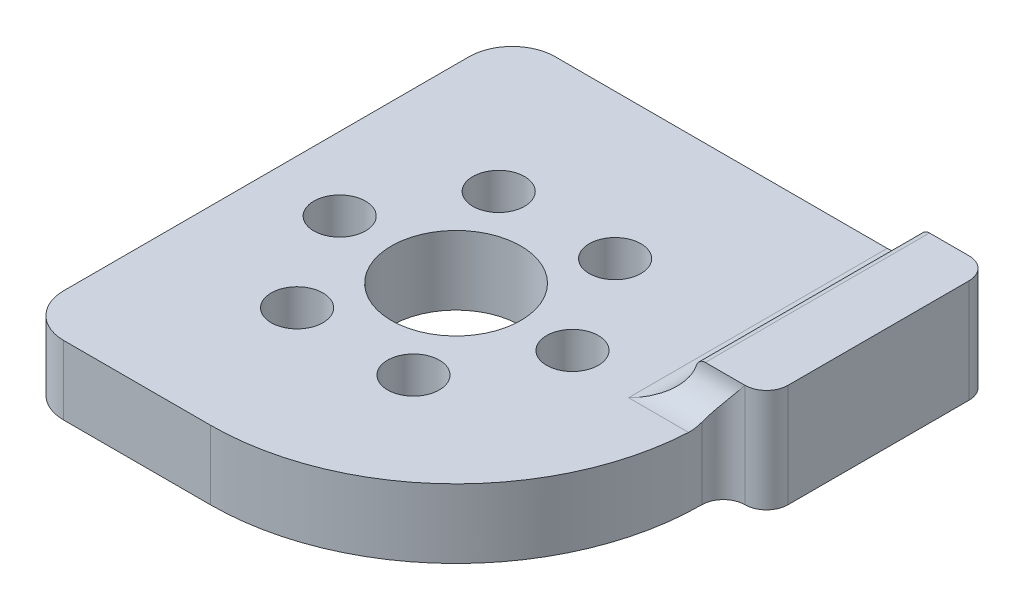
ISO-10303-21;
HEADER;
FILE_DESCRIPTION(('STEP AP214'),'2;1');
FILE_NAME('part.step','',(''),(''),'','','');
FILE_SCHEMA(('AUTOMOTIVE_DESIGN { 1 0 10303 214 1 1 1 1 }'));
ENDSEC;
DATA;
#1=APPLICATION_CONTEXT('core data for automotive mechanical design processes');
#2=APPLICATION_PROTOCOL_DEFINITION('international standard','automotive_design',2000,#1);
#3=PRODUCT_CONTEXT('',#1,'mechanical');
#4=PRODUCT('Part','Part','',(#3));
#5=PRODUCT_RELATED_PRODUCT_CATEGORY('part','',(#4));
#6=PRODUCT_DEFINITION_FORMATION('','',#4);
#7=PRODUCT_DEFINITION_CONTEXT('part definition',#1,'design');
#8=PRODUCT_DEFINITION('design','',#6,#7);
#9=PRODUCT_DEFINITION_SHAPE('','',#8);
#10=(LENGTH_UNIT() NAMED_UNIT(*) SI_UNIT(.MILLI.,.METRE.));
#11=(NAMED_UNIT(*) PLANE_ANGLE_UNIT() SI_UNIT($,.RADIAN.));
#12=(NAMED_UNIT(*) SI_UNIT($,.STERADIAN.) SOLID_ANGLE_UNIT());
#13=UNCERTAINTY_MEASURE_WITH_UNIT(LENGTH_MEASURE(1.E-05),#10,'distance_accuracy_value','');
#14=(GEOMETRIC_REPRESENTATION_CONTEXT(3) GLOBAL_UNCERTAINTY_ASSIGNED_CONTEXT((#13)) GLOBAL_UNIT_ASSIGNED_CONTEXT((#10,
#11,#12)) REPRESENTATION_CONTEXT('',''));
#15=CARTESIAN_POINT('',(0.,0.,0.));
#16=DIRECTION('',(0.,0.,1.));
#17=DIRECTION('',(1.,0.,0.));
#18=AXIS2_PLACEMENT_3D('',#15,#16,#17);
#19=CARTESIAN_POINT('',(-6.74999999999997,-8.,-11.6913429510899));
#20=DIRECTION('',(0.,1.,0.));
#21=DIRECTION('',(0.,0.,1.));
#22=AXIS2_PLACEMENT_3D('',#19,#20,#21);
#23=CYLINDRICAL_SURFACE('',#22,1.75);
#24=CARTESIAN_POINT('',(-6.74999999999997,0.,-11.6913429510899));
#25=DIRECTION('',(0.,1.,0.));
#26=DIRECTION('',(0.,0.,1.));
#27=AXIS2_PLACEMENT_3D('',#24,#25,#26);
#28=CIRCLE('',#27,1.75);
#29=CARTESIAN_POINT('',(-6.74999999999997,0.,-9.94134295108994));
#30=VERTEX_POINT('',#29);
#31=EDGE_CURVE('E183',#30,#30,#28,.T.);
#32=ORIENTED_EDGE('',*,*,#31,.F.);
#33=EDGE_LOOP('',(#32));
#34=FACE_BOUND('',#33,.T.);
#35=CARTESIAN_POINT('',(-6.74999999999997,3.,-11.6913429510899));
#36=DIRECTION('',(0.,1.,0.));
#37=DIRECTION('',(0.,0.,1.));
#38=AXIS2_PLACEMENT_3D('',#35,#36,#37);
#39=CIRCLE('',#38,1.75);
#40=CARTESIAN_POINT('',(-6.74999999999997,3.,-9.94134295108994));
#41=VERTEX_POINT('',#40);
#42=EDGE_CURVE('E355',#41,#41,#39,.F.);
#43=ORIENTED_EDGE('',*,*,#42,.F.);
#44=EDGE_LOOP('',(#43));
#45=FACE_BOUND('',#44,.T.);
#46=ADVANCED_FACE('F35',(#34,#45),#23,.F.);
#47=CARTESIAN_POINT('',(6.75000000000005,-8.,-11.6913429510899));
#48=DIRECTION('',(0.,1.,0.));
#49=DIRECTION('',(0.,0.,1.));
#50=AXIS2_PLACEMENT_3D('',#47,#48,#49);
#51=CYLINDRICAL_SURFACE('',#50,1.75);
#52=CARTESIAN_POINT('',(6.75000000000005,0.,-11.6913429510899));
#53=DIRECTION('',(0.,1.,0.));
#54=DIRECTION('',(0.,0.,1.));
#55=AXIS2_PLACEMENT_3D('',#52,#53,#54);
#56=CIRCLE('',#55,1.75);
#57=CARTESIAN_POINT('',(6.75000000000005,0.,-9.94134295108989));
#58=VERTEX_POINT('',#57);
#59=EDGE_CURVE('E186',#58,#58,#56,.T.);
#60=ORIENTED_EDGE('',*,*,#59,.F.);
#61=EDGE_LOOP('',(#60));
#62=FACE_BOUND('',#61,.T.);
#63=CARTESIAN_POINT('',(6.75000000000005,3.,-11.6913429510899));
#64=DIRECTION('',(0.,1.,0.));
#65=DIRECTION('',(0.,0.,1.));
#66=AXIS2_PLACEMENT_3D('',#63,#64,#65);
#67=CIRCLE('',#66,1.75);
#68=CARTESIAN_POINT('',(6.75000000000005,3.,-9.94134295108989));
#69=VERTEX_POINT('',#68);
#70=EDGE_CURVE('E352',#69,#69,#67,.F.);
#71=ORIENTED_EDGE('',*,*,#70,.F.);
#72=EDGE_LOOP('',(#71));
#73=FACE_BOUND('',#72,.T.);
#74=ADVANCED_FACE('F255',(#62,#73),#51,.F.);
#75=CARTESIAN_POINT('',(13.5,-8.,0.));
#76=DIRECTION('',(0.,1.,0.));
#77=DIRECTION('',(0.,0.,1.));
#78=AXIS2_PLACEMENT_3D('',#75,#76,#77);
#79=CYLINDRICAL_SURFACE('',#78,1.75);
#80=CARTESIAN_POINT('',(13.5,0.,0.));
#81=DIRECTION('',(0.,1.,0.));
#82=DIRECTION('',(0.,0.,1.));
#83=AXIS2_PLACEMENT_3D('',#80,#81,#82);
#84=CIRCLE('',#83,1.75);
#85=CARTESIAN_POINT('',(13.5,0.,1.75000000000009));
#86=VERTEX_POINT('',#85);
#87=EDGE_CURVE('E190',#86,#86,#84,.T.);
#88=ORIENTED_EDGE('',*,*,#87,.F.);
#89=EDGE_LOOP('',(#88));
#90=FACE_BOUND('',#89,.T.);
#91=CARTESIAN_POINT('',(13.5,3.,0.));
#92=DIRECTION('',(0.,1.,0.));
#93=DIRECTION('',(0.,0.,1.));
#94=AXIS2_PLACEMENT_3D('',#91,#92,#93);
#95=CIRCLE('',#94,1.75);
#96=CARTESIAN_POINT('',(13.5,3.,1.75000000000009));
#97=VERTEX_POINT('',#96);
#98=EDGE_CURVE('E349',#97,#97,#95,.F.);
#99=ORIENTED_EDGE('',*,*,#98,.F.);
#100=EDGE_LOOP('',(#99));
#101=FACE_BOUND('',#100,.T.);
#102=ADVANCED_FACE('F261',(#90,#101),#79,.F.);
#103=CARTESIAN_POINT('',(6.74999999999989,-8.,11.69134295109));
#104=DIRECTION('',(0.,1.,0.));
#105=DIRECTION('',(0.,0.,1.));
#106=AXIS2_PLACEMENT_3D('',#103,#104,#105);
#107=CYLINDRICAL_SURFACE('',#106,1.75);
#108=CARTESIAN_POINT('',(6.74999999999989,0.,11.69134295109));
#109=DIRECTION('',(0.,1.,0.));
#110=DIRECTION('',(0.,0.,1.));
#111=AXIS2_PLACEMENT_3D('',#108,#109,#110);
#112=CIRCLE('',#111,1.75);
#113=CARTESIAN_POINT('',(6.74999999999989,0.,13.44134295109));
#114=VERTEX_POINT('',#113);
#115=EDGE_CURVE('E193',#114,#114,#112,.T.);
#116=ORIENTED_EDGE('',*,*,#115,.F.);
#117=EDGE_LOOP('',(#116));
#118=FACE_BOUND('',#117,.T.);
#119=CARTESIAN_POINT('',(6.74999999999989,3.,11.69134295109));
#120=DIRECTION('',(0.,1.,0.));
#121=DIRECTION('',(0.,0.,1.));
#122=AXIS2_PLACEMENT_3D('',#119,#120,#121);
#123=CIRCLE('',#122,1.75);
#124=CARTESIAN_POINT('',(6.74999999999989,3.,13.44134295109));
#125=VERTEX_POINT('',#124);
#126=EDGE_CURVE('E346',#125,#125,#123,.F.);
#127=ORIENTED_EDGE('',*,*,#126,.F.);
#128=EDGE_LOOP('',(#127));
#129=FACE_BOUND('',#128,.T.);
#130=ADVANCED_FACE('F272',(#118,#129),#107,.F.);
#131=CARTESIAN_POINT('',(-6.75000000000014,-8.,11.6913429510898));
#132=DIRECTION('',(0.,1.,0.));
#133=DIRECTION('',(0.,0.,1.));
#134=AXIS2_PLACEMENT_3D('',#131,#132,#133);
#135=CYLINDRICAL_SURFACE('',#134,1.75);
#136=CARTESIAN_POINT('',(-6.75000000000014,0.,11.6913429510898));
#137=DIRECTION('',(0.,1.,0.));
#138=DIRECTION('',(0.,0.,1.));
#139=AXIS2_PLACEMENT_3D('',#136,#137,#138);
#140=CIRCLE('',#139,1.75);
#141=CARTESIAN_POINT('',(-6.75000000000014,0.,13.4413429510898));
#142=VERTEX_POINT('',#141);
#143=EDGE_CURVE('E196',#142,#142,#140,.T.);
#144=ORIENTED_EDGE('',*,*,#143,.F.);
#145=EDGE_LOOP('',(#144));
#146=FACE_BOUND('',#145,.T.);
#147=CARTESIAN_POINT('',(-6.75000000000014,3.,11.6913429510898));
#148=DIRECTION('',(0.,1.,0.));
#149=DIRECTION('',(0.,0.,1.));
#150=AXIS2_PLACEMENT_3D('',#147,#148,#149);
#151=CIRCLE('',#150,1.75);
#152=CARTESIAN_POINT('',(-6.75000000000014,3.,13.4413429510898));
#153=VERTEX_POINT('',#152);
#154=EDGE_CURVE('E342',#153,#153,#151,.F.);
#155=ORIENTED_EDGE('',*,*,#154,.F.);
#156=EDGE_LOOP('',(#155));
#157=FACE_BOUND('',#156,.T.);
#158=ADVANCED_FACE('F267',(#146,#157),#135,.F.);
#159=CARTESIAN_POINT('',(-13.5,-8.,0.));
#160=DIRECTION('',(0.,1.,0.));
#161=DIRECTION('',(0.,0.,1.));
#162=AXIS2_PLACEMENT_3D('',#159,#160,#161);
#163=CYLINDRICAL_SURFACE('',#162,1.75);
#164=CARTESIAN_POINT('',(-13.5,0.,0.));
#165=DIRECTION('',(0.,1.,0.));
#166=DIRECTION('',(0.,0.,1.));
#167=AXIS2_PLACEMENT_3D('',#164,#165,#166);
#168=CIRCLE('',#167,1.75);
#169=CARTESIAN_POINT('',(-13.5,0.,1.75));
#170=VERTEX_POINT('',#169);
#171=EDGE_CURVE('E173',#170,#170,#168,.T.);
#172=ORIENTED_EDGE('',*,*,#171,.F.);
#173=EDGE_LOOP('',(#172));
#174=FACE_BOUND('',#173,.T.);
#175=CARTESIAN_POINT('',(-13.5,3.,0.));
#176=DIRECTION('',(0.,1.,0.));
#177=DIRECTION('',(0.,0.,1.));
#178=AXIS2_PLACEMENT_3D('',#175,#176,#177);
#179=CIRCLE('',#178,1.75);
#180=CARTESIAN_POINT('',(-13.5,3.,1.75));
#181=VERTEX_POINT('',#180);
#182=EDGE_CURVE('E339',#181,#181,#179,.F.);
#183=ORIENTED_EDGE('',*,*,#182,.F.);
#184=EDGE_LOOP('',(#183));
#185=FACE_BOUND('',#184,.T.);
#186=ADVANCED_FACE('F297',(#174,#185),#163,.F.);
#187=CARTESIAN_POINT('',(33.5,8.,-28.5));
#188=DIRECTION('',(-1.,0.,0.));
#189=DIRECTION('',(0.,0.,1.));
#190=AXIS2_PLACEMENT_3D('',#187,#188,#189);
#191=PLANE('',#190);
#192=DIRECTION('',(0.,0.,-1.));
#193=VECTOR('',#192,1.);
#194=CARTESIAN_POINT('',(33.5,0.,-28.5));
#195=LINE('',#194,#193);
#196=CARTESIAN_POINT('',(33.5,0.,-4.99999999999999));
#197=VERTEX_POINT('',#196);
#198=CARTESIAN_POINT('',(33.5,0.,-26.));
#199=VERTEX_POINT('',#198);
#200=EDGE_CURVE('E169',#197,#199,#195,.T.);
#201=ORIENTED_EDGE('',*,*,#200,.T.);
#202=DIRECTION('',(0.,-1.,0.));
#203=VECTOR('',#202,1.);
#204=CARTESIAN_POINT('',(33.5,8.,-26.));
#205=LINE('',#204,#203);
#206=CARTESIAN_POINT('',(33.5,12.,-26.));
#207=VERTEX_POINT('',#206);
#208=EDGE_CURVE('E306',#199,#207,#205,.F.);
#209=ORIENTED_EDGE('',*,*,#208,.T.);
#210=DIRECTION('',(0.,0.,-1.));
#211=VECTOR('',#210,1.);
#212=CARTESIAN_POINT('',(33.5,12.,-2.49999999999999));
#213=LINE('',#212,#211);
#214=CARTESIAN_POINT('',(33.5,12.,-4.99999999999999));
#215=VERTEX_POINT('',#214);
#216=EDGE_CURVE('E358',#215,#207,#213,.T.);
#217=ORIENTED_EDGE('',*,*,#216,.F.);
#218=DIRECTION('',(0.,-1.,0.));
#219=VECTOR('',#218,1.);
#220=CARTESIAN_POINT('',(33.5,8.,-4.99999999999999));
#221=LINE('',#220,#219);
#222=EDGE_CURVE('E158',#215,#197,#221,.T.);
#223=ORIENTED_EDGE('',*,*,#222,.T.);
#224=EDGE_LOOP('',(#201,#209,#217,#223));
#225=FACE_BOUND('',#224,.T.);
#226=ADVANCED_FACE('F294',(#225),#191,.F.);
#227=CARTESIAN_POINT('',(0.,8.,-28.5));
#228=DIRECTION('',(0.,0.,1.));
#229=DIRECTION('',(1.,0.,0.));
#230=AXIS2_PLACEMENT_3D('',#227,#228,#229);
#231=PLANE('',#230);
#232=CARTESIAN_POINT('',(21.5,12.,-28.5));
#233=DIRECTION('',(0.,0.,1.));
#234=DIRECTION('',(1.,0.,0.));
#235=AXIS2_PLACEMENT_3D('',#232,#233,#234);
#236=CIRCLE('',#235,4.);
#237=CARTESIAN_POINT('',(21.5,8.,-28.5));
#238=VERTEX_POINT('',#237);
#239=CARTESIAN_POINT('',(25.4191835884531,11.2,-28.5));
#240=VERTEX_POINT('',#239);
#241=EDGE_CURVE('E215',#238,#240,#236,.T.);
#242=ORIENTED_EDGE('',*,*,#241,.T.);
#243=CARTESIAN_POINT('',(26.3989794855664,11.,-28.5));
#244=DIRECTION('',(0.,0.,1.));
#245=DIRECTION('',(1.,0.,0.));
#246=AXIS2_PLACEMENT_3D('',#243,#244,#245);
#247=CIRCLE('',#246,1.);
#248=CARTESIAN_POINT('',(26.3989794855664,12.,-28.5));
#249=VERTEX_POINT('',#248);
#250=EDGE_CURVE('E11',#240,#249,#247,.F.);
#251=ORIENTED_EDGE('',*,*,#250,.T.);
#252=DIRECTION('',(-1.,0.,0.));
#253=VECTOR('',#252,1.);
#254=CARTESIAN_POINT('',(33.5,12.,-28.5));
#255=LINE('',#254,#253);
#256=CARTESIAN_POINT('',(31.,12.,-28.5));
#257=VERTEX_POINT('',#256);
#258=EDGE_CURVE('E371',#257,#249,#255,.T.);
#259=ORIENTED_EDGE('',*,*,#258,.F.);
#260=DIRECTION('',(0.,-1.,0.));
#261=VECTOR('',#260,1.);
#262=CARTESIAN_POINT('',(31.,8.,-28.5));
#263=LINE('',#262,#261);
#264=CARTESIAN_POINT('',(31.,0.,-28.5));
#265=VERTEX_POINT('',#264);
#266=EDGE_CURVE('E319',#257,#265,#263,.T.);
#267=ORIENTED_EDGE('',*,*,#266,.T.);
#268=DIRECTION('',(-1.,0.,0.));
#269=VECTOR('',#268,1.);
#270=CARTESIAN_POINT('',(0.,0.,-28.5));
#271=LINE('',#270,#269);
#272=CARTESIAN_POINT('',(-17.,0.,-28.5));
#273=VERTEX_POINT('',#272);
#274=EDGE_CURVE('E172',#265,#273,#271,.T.);
#275=ORIENTED_EDGE('',*,*,#274,.T.);
#276=DIRECTION('',(0.,-1.,0.));
#277=VECTOR('',#276,1.);
#278=CARTESIAN_POINT('',(-17.,8.,-28.5));
#279=LINE('',#278,#277);
#280=CARTESIAN_POINT('',(-17.,8.,-28.5));
#281=VERTEX_POINT('',#280);
#282=EDGE_CURVE('E336',#273,#281,#279,.F.);
#283=ORIENTED_EDGE('',*,*,#282,.T.);
#284=DIRECTION('',(-1.,0.,0.));
#285=VECTOR('',#284,1.);
#286=CARTESIAN_POINT('',(0.,8.,-28.5));
#287=LINE('',#286,#285);
#288=EDGE_CURVE('E181',#238,#281,#287,.T.);
#289=ORIENTED_EDGE('',*,*,#288,.F.);
#290=EDGE_LOOP('',(#242,#251,#259,#267,#275,#283,#289));
#291=FACE_BOUND('',#290,.T.);
#292=ADVANCED_FACE('F291',(#291),#231,.F.);
#293=CARTESIAN_POINT('',(-22.,8.,-28.5));
#294=DIRECTION('',(1.,0.,0.));
#295=DIRECTION('',(0.,0.,-1.));
#296=AXIS2_PLACEMENT_3D('',#293,#294,#295);
#297=PLANE('',#296);
#298=DIRECTION('',(0.,0.,1.));
#299=VECTOR('',#298,1.);
#300=CARTESIAN_POINT('',(-22.,0.,-28.5));
#301=LINE('',#300,#299);
#302=CARTESIAN_POINT('',(-22.,0.,-23.5));
#303=VERTEX_POINT('',#302);
#304=CARTESIAN_POINT('',(-22.,0.,23.5));
#305=VERTEX_POINT('',#304);
#306=EDGE_CURVE('E176',#303,#305,#301,.T.);
#307=ORIENTED_EDGE('',*,*,#306,.T.);
#308=DIRECTION('',(0.,-1.,0.));
#309=VECTOR('',#308,1.);
#310=CARTESIAN_POINT('',(-22.,8.,23.5));
#311=LINE('',#310,#309);
#312=CARTESIAN_POINT('',(-22.,8.,23.5));
#313=VERTEX_POINT('',#312);
#314=EDGE_CURVE('E331',#305,#313,#311,.F.);
#315=ORIENTED_EDGE('',*,*,#314,.T.);
#316=DIRECTION('',(0.,0.,1.));
#317=VECTOR('',#316,1.);
#318=CARTESIAN_POINT('',(-22.,8.,-28.5));
#319=LINE('',#318,#317);
#320=CARTESIAN_POINT('',(-22.,8.,-23.5));
#321=VERTEX_POINT('',#320);
#322=EDGE_CURVE('E148',#321,#313,#319,.T.);
#323=ORIENTED_EDGE('',*,*,#322,.F.);
#324=DIRECTION('',(0.,-1.,0.));
#325=VECTOR('',#324,1.);
#326=CARTESIAN_POINT('',(-22.,8.,-23.5));
#327=LINE('',#326,#325);
#328=EDGE_CURVE('E328',#321,#303,#327,.T.);
#329=ORIENTED_EDGE('',*,*,#328,.T.);
#330=EDGE_LOOP('',(#307,#315,#323,#329));
#331=FACE_BOUND('',#330,.T.);
#332=ADVANCED_FACE('F288',(#331),#297,.F.);
#333=CARTESIAN_POINT('',(0.,8.,28.5));
#334=DIRECTION('',(0.,0.,-1.));
#335=DIRECTION('',(-1.,0.,0.));
#336=AXIS2_PLACEMENT_3D('',#333,#334,#335);
#337=PLANE('',#336);
#338=DIRECTION('',(1.,0.,0.));
#339=VECTOR('',#338,1.);
#340=CARTESIAN_POINT('',(0.,8.,28.5));
#341=LINE('',#340,#339);
#342=CARTESIAN_POINT('',(-17.,8.,28.5));
#343=VERTEX_POINT('',#342);
#344=CARTESIAN_POINT('',(0.,8.,28.5));
#345=VERTEX_POINT('',#344);
#346=EDGE_CURVE('E135',#343,#345,#341,.T.);
#347=ORIENTED_EDGE('',*,*,#346,.F.);
#348=DIRECTION('',(0.,-1.,0.));
#349=VECTOR('',#348,1.);
#350=CARTESIAN_POINT('',(-17.,8.,28.5));
#351=LINE('',#350,#349);
#352=CARTESIAN_POINT('',(-17.,0.,28.5));
#353=VERTEX_POINT('',#352);
#354=EDGE_CURVE('E317',#343,#353,#351,.T.);
#355=ORIENTED_EDGE('',*,*,#354,.T.);
#356=DIRECTION('',(1.,0.,0.));
#357=VECTOR('',#356,1.);
#358=CARTESIAN_POINT('',(0.,0.,28.5));
#359=LINE('',#358,#357);
#360=CARTESIAN_POINT('',(0.,0.,28.5));
#361=VERTEX_POINT('',#360);
#362=EDGE_CURVE('E154',#353,#361,#359,.T.);
#363=ORIENTED_EDGE('',*,*,#362,.T.);
#364=DIRECTION('',(0.,-1.,0.));
#365=VECTOR('',#364,1.);
#366=CARTESIAN_POINT('',(0.,8.,28.5));
#367=LINE('',#366,#365);
#368=EDGE_CURVE('E151',#345,#361,#367,.T.);
#369=ORIENTED_EDGE('',*,*,#368,.F.);
#370=EDGE_LOOP('',(#347,#355,#363,#369));
#371=FACE_BOUND('',#370,.T.);
#372=ADVANCED_FACE('F152',(#371),#337,.F.);
#373=CARTESIAN_POINT('',(0.,8.,0.));
#374=DIRECTION('',(0.,-1.,0.));
#375=DIRECTION('',(0.,0.,-1.));
#376=AXIS2_PLACEMENT_3D('',#373,#374,#375);
#377=CYLINDRICAL_SURFACE('',#376,28.5);
#378=CARTESIAN_POINT('',(0.,0.,0.));
#379=DIRECTION('',(0.,1.,0.));
#380=DIRECTION('',(0.,0.,1.));
#381=AXIS2_PLACEMENT_3D('',#378,#379,#380);
#382=CIRCLE('',#381,28.5);
#383=CARTESIAN_POINT('',(28.5,0.,0.));
#384=VERTEX_POINT('',#383);
#385=EDGE_CURVE('E180',#361,#384,#382,.T.);
#386=ORIENTED_EDGE('',*,*,#385,.T.);
#387=DIRECTION('',(0.,-1.,0.));
#388=VECTOR('',#387,1.);
#389=CARTESIAN_POINT('',(28.5,8.,0.));
#390=LINE('',#389,#388);
#391=CARTESIAN_POINT('',(28.5,8.29190075645217,0.));
#392=VERTEX_POINT('',#391);
#393=EDGE_CURVE('E159',#392,#384,#390,.T.);
#394=ORIENTED_EDGE('',*,*,#393,.F.);
#395=CARTESIAN_POINT('',(28.5,8.29190075645217,0.));
#396=CARTESIAN_POINT('',(28.500009207275,8.24358492779969,0.119385080901433));
#397=CARTESIAN_POINT('',(28.4992498837006,8.20107441326889,0.241115751765817));
#398=CARTESIAN_POINT('',(28.4961003365139,8.12831634844569,0.486934399679963));
#399=CARTESIAN_POINT('',(28.493725365242,8.09795829475839,0.610989871070372));
#400=CARTESIAN_POINT('',(28.4872547285807,8.04924717117481,0.861391719204725));
#401=CARTESIAN_POINT('',(28.4831590630342,8.03089410237601,0.9877380961581));
#402=CARTESIAN_POINT('',(28.4731839768156,8.00620289768269,1.24273086801922));
#403=CARTESIAN_POINT('',(28.4672881521866,7.999979313348,1.37138771919365));
#404=CARTESIAN_POINT('',(28.4604989415154,8.,1.50000000000001));
#405=B_SPLINE_CURVE_WITH_KNOTS('',3,(#395,#396,#397,#398,#399,#400,#401,#402,#403,#404),
.UNSPECIFIED.,.F.,.F.,(4,2,2,2,4),(0.,0.386216428712126,0.768836514385108,1.15145663503666,
1.53767306019371),.UNSPECIFIED.);
#406=CARTESIAN_POINT('',(28.4604989415154,8.,1.50000000000001));
#407=VERTEX_POINT('',#406);
#408=EDGE_CURVE('E163',#392,#407,#405,.T.);
#409=ORIENTED_EDGE('',*,*,#408,.T.);
#410=CARTESIAN_POINT('',(0.,8.,0.));
#411=DIRECTION('',(0.,1.,0.));
#412=DIRECTION('',(0.,0.,1.));
#413=AXIS2_PLACEMENT_3D('',#410,#411,#412);
#414=CIRCLE('',#413,28.5);
#415=EDGE_CURVE('E141',#345,#407,#414,.T.);
#416=ORIENTED_EDGE('',*,*,#415,.F.);
#417=ORIENTED_EDGE('',*,*,#368,.T.);
#418=EDGE_LOOP('',(#386,#394,#409,#416,#417));
#419=FACE_BOUND('',#418,.T.);
#420=ADVANCED_FACE('F161',(#419),#377,.T.);
#421=CARTESIAN_POINT('',(0.,8.,0.));
#422=DIRECTION('',(0.,1.,0.));
#423=DIRECTION('',(0.,0.,1.));
#424=AXIS2_PLACEMENT_3D('',#421,#422,#423);
#425=PLANE('',#424);
#426=CARTESIAN_POINT('',(0.,8.,0.));
#427=DIRECTION('',(0.,1.,0.));
#428=DIRECTION('',(0.,0.,1.));
#429=AXIS2_PLACEMENT_3D('',#426,#427,#428);
#430=CIRCLE('',#429,7.5);
#431=CARTESIAN_POINT('',(0.,8.,7.5));
#432=VERTEX_POINT('',#431);
#433=EDGE_CURVE('E682',#432,#432,#430,.T.);
#434=ORIENTED_EDGE('',*,*,#433,.F.);
#435=EDGE_LOOP('',(#434));
#436=FACE_BOUND('',#435,.T.);
#437=CARTESIAN_POINT('',(-13.5,8.,0.));
#438=DIRECTION('',(0.,1.,0.));
#439=DIRECTION('',(0.,0.,1.));
#440=AXIS2_PLACEMENT_3D('',#437,#438,#439);
#441=CIRCLE('',#440,3.);
#442=CARTESIAN_POINT('',(-13.5,8.,3.));
#443=VERTEX_POINT('',#442);
#444=EDGE_CURVE('E688',#443,#443,#441,.T.);
#445=ORIENTED_EDGE('',*,*,#444,.F.);
#446=EDGE_LOOP('',(#445));
#447=FACE_BOUND('',#446,.T.);
#448=CARTESIAN_POINT('',(-6.75000000000014,8.,11.6913429510898));
#449=DIRECTION('',(0.,1.,0.));
#450=DIRECTION('',(0.,0.,1.));
#451=AXIS2_PLACEMENT_3D('',#448,#449,#450);
#452=CIRCLE('',#451,3.);
#453=CARTESIAN_POINT('',(-6.75000000000014,8.,14.6913429510898));
#454=VERTEX_POINT('',#453);
#455=EDGE_CURVE('E676',#454,#454,#452,.T.);
#456=ORIENTED_EDGE('',*,*,#455,.F.);
#457=EDGE_LOOP('',(#456));
#458=FACE_BOUND('',#457,.T.);
#459=CARTESIAN_POINT('',(6.74999999999989,8.,11.69134295109));
#460=DIRECTION('',(0.,1.,0.));
#461=DIRECTION('',(0.,0.,1.));
#462=AXIS2_PLACEMENT_3D('',#459,#460,#461);
#463=CIRCLE('',#462,3.);
#464=CARTESIAN_POINT('',(6.74999999999989,8.,14.69134295109));
#465=VERTEX_POINT('',#464);
#466=EDGE_CURVE('E679',#465,#465,#463,.T.);
#467=ORIENTED_EDGE('',*,*,#466,.F.);
#468=EDGE_LOOP('',(#467));
#469=FACE_BOUND('',#468,.T.);
#470=CARTESIAN_POINT('',(13.5,8.,0.));
#471=DIRECTION('',(0.,1.,0.));
#472=DIRECTION('',(0.,0.,1.));
#473=AXIS2_PLACEMENT_3D('',#470,#471,#472);
#474=CIRCLE('',#473,3.);
#475=CARTESIAN_POINT('',(13.5,8.,3.0000000000001));
#476=VERTEX_POINT('',#475);
#477=EDGE_CURVE('E701',#476,#476,#474,.T.);
#478=ORIENTED_EDGE('',*,*,#477,.F.);
#479=EDGE_LOOP('',(#478));
#480=FACE_BOUND('',#479,.T.);
#481=CARTESIAN_POINT('',(6.75000000000005,8.,-11.6913429510899));
#482=DIRECTION('',(0.,1.,0.));
#483=DIRECTION('',(0.,0.,1.));
#484=AXIS2_PLACEMENT_3D('',#481,#482,#483);
#485=CIRCLE('',#484,3.);
#486=CARTESIAN_POINT('',(6.75000000000005,8.,-8.69134295108989));
#487=VERTEX_POINT('',#486);
#488=EDGE_CURVE('E695',#487,#487,#485,.T.);
#489=ORIENTED_EDGE('',*,*,#488,.F.);
#490=EDGE_LOOP('',(#489));
#491=FACE_BOUND('',#490,.T.);
#492=CARTESIAN_POINT('',(-6.74999999999997,8.,-11.6913429510899));
#493=DIRECTION('',(0.,1.,0.));
#494=DIRECTION('',(0.,0.,1.));
#495=AXIS2_PLACEMENT_3D('',#492,#493,#494);
#496=CIRCLE('',#495,3.);
#497=CARTESIAN_POINT('',(-6.74999999999997,8.,-8.69134295108994));
#498=VERTEX_POINT('',#497);
#499=EDGE_CURVE('E689',#498,#498,#496,.T.);
#500=ORIENTED_EDGE('',*,*,#499,.F.);
#501=EDGE_LOOP('',(#500));
#502=FACE_BOUND('',#501,.T.);
#503=ORIENTED_EDGE('',*,*,#322,.T.);
#504=CARTESIAN_POINT('',(-17.,8.,23.5));
#505=DIRECTION('',(0.,1.,0.));
#506=DIRECTION('',(0.,0.,1.));
#507=AXIS2_PLACEMENT_3D('',#504,#505,#506);
#508=CIRCLE('',#507,5.);
#509=EDGE_CURVE('E144',#313,#343,#508,.T.);
#510=ORIENTED_EDGE('',*,*,#509,.T.);
#511=ORIENTED_EDGE('',*,*,#346,.T.);
#512=ORIENTED_EDGE('',*,*,#415,.T.);
#513=DIRECTION('',(1.,0.,0.));
#514=VECTOR('',#513,1.);
#515=CARTESIAN_POINT('',(0.,8.,1.50000000000001));
#516=LINE('',#515,#514);
#517=CARTESIAN_POINT('',(21.5,8.,1.50000000000001));
#518=VERTEX_POINT('',#517);
#519=EDGE_CURVE('E217',#407,#518,#516,.F.);
#520=ORIENTED_EDGE('',*,*,#519,.T.);
#521=DIRECTION('',(0.,0.,1.));
#522=VECTOR('',#521,1.);
#523=CARTESIAN_POINT('',(21.5,8.,0.));
#524=LINE('',#523,#522);
#525=EDGE_CURVE('E213',#518,#238,#524,.F.);
#526=ORIENTED_EDGE('',*,*,#525,.T.);
#527=ORIENTED_EDGE('',*,*,#288,.T.);
#528=CARTESIAN_POINT('',(-17.,8.,-23.5));
#529=DIRECTION('',(0.,1.,0.));
#530=DIRECTION('',(0.,0.,1.));
#531=AXIS2_PLACEMENT_3D('',#528,#529,#530);
#532=CIRCLE('',#531,5.);
#533=EDGE_CURVE('E333',#281,#321,#532,.T.);
#534=ORIENTED_EDGE('',*,*,#533,.T.);
#535=EDGE_LOOP('',(#503,#510,#511,#512,#520,#526,#527,#534));
#536=FACE_BOUND('',#535,.T.);
#537=ADVANCED_FACE('F138',(#436,#447,#458,#469,#480,#491,#502,#536),#425,.T.);
#538=CARTESIAN_POINT('',(0.,0.,0.));
#539=DIRECTION('',(0.,1.,0.));
#540=DIRECTION('',(0.,0.,1.));
#541=AXIS2_PLACEMENT_3D('',#538,#539,#540);
#542=PLANE('',#541);
#543=CARTESIAN_POINT('',(0.,0.,0.));
#544=DIRECTION('',(0.,1.,0.));
#545=DIRECTION('',(0.,0.,1.));
#546=AXIS2_PLACEMENT_3D('',#543,#544,#545);
#547=CIRCLE('',#546,7.5);
#548=CARTESIAN_POINT('',(0.,0.,7.5));
#549=VERTEX_POINT('',#548);
#550=EDGE_CURVE('E40',#549,#549,#547,.T.);
#551=ORIENTED_EDGE('',*,*,#550,.T.);
#552=EDGE_LOOP('',(#551));
#553=FACE_BOUND('',#552,.T.);
#554=ORIENTED_EDGE('',*,*,#171,.T.);
#555=EDGE_LOOP('',(#554));
#556=FACE_BOUND('',#555,.T.);
#557=ORIENTED_EDGE('',*,*,#143,.T.);
#558=EDGE_LOOP('',(#557));
#559=FACE_BOUND('',#558,.T.);
#560=ORIENTED_EDGE('',*,*,#115,.T.);
#561=EDGE_LOOP('',(#560));
#562=FACE_BOUND('',#561,.T.);
#563=ORIENTED_EDGE('',*,*,#87,.T.);
#564=EDGE_LOOP('',(#563));
#565=FACE_BOUND('',#564,.T.);
#566=ORIENTED_EDGE('',*,*,#59,.T.);
#567=EDGE_LOOP('',(#566));
#568=FACE_BOUND('',#567,.T.);
#569=ORIENTED_EDGE('',*,*,#31,.T.);
#570=EDGE_LOOP('',(#569));
#571=FACE_BOUND('',#570,.T.);
#572=ORIENTED_EDGE('',*,*,#362,.F.);
#573=CARTESIAN_POINT('',(-17.,0.,23.5));
#574=DIRECTION('',(0.,1.,0.));
#575=DIRECTION('',(0.,0.,1.));
#576=AXIS2_PLACEMENT_3D('',#573,#574,#575);
#577=CIRCLE('',#576,5.);
#578=EDGE_CURVE('E326',#353,#305,#577,.F.);
#579=ORIENTED_EDGE('',*,*,#578,.T.);
#580=ORIENTED_EDGE('',*,*,#306,.F.);
#581=CARTESIAN_POINT('',(-17.,0.,-23.5));
#582=DIRECTION('',(0.,1.,0.));
#583=DIRECTION('',(0.,0.,1.));
#584=AXIS2_PLACEMENT_3D('',#581,#582,#583);
#585=CIRCLE('',#584,5.);
#586=EDGE_CURVE('E324',#303,#273,#585,.F.);
#587=ORIENTED_EDGE('',*,*,#586,.T.);
#588=ORIENTED_EDGE('',*,*,#274,.F.);
#589=CARTESIAN_POINT('',(31.,0.,-26.));
#590=DIRECTION('',(0.,1.,0.));
#591=DIRECTION('',(0.,0.,1.));
#592=AXIS2_PLACEMENT_3D('',#589,#590,#591);
#593=CIRCLE('',#592,2.5);
#594=EDGE_CURVE('E313',#265,#199,#593,.F.);
#595=ORIENTED_EDGE('',*,*,#594,.T.);
#596=ORIENTED_EDGE('',*,*,#200,.F.);
#597=CARTESIAN_POINT('',(31.,0.,-4.99999999999999));
#598=DIRECTION('',(0.,1.,0.));
#599=DIRECTION('',(0.,0.,1.));
#600=AXIS2_PLACEMENT_3D('',#597,#598,#599);
#601=CIRCLE('',#600,2.5);
#602=CARTESIAN_POINT('',(31.,0.,-2.49999999999999));
#603=VERTEX_POINT('',#602);
#604=EDGE_CURVE('E203',#197,#603,#601,.F.);
#605=ORIENTED_EDGE('',*,*,#604,.T.);
#606=CARTESIAN_POINT('',(31.,0.,0.));
#607=DIRECTION('',(0.,1.,0.));
#608=DIRECTION('',(0.,0.,1.));
#609=AXIS2_PLACEMENT_3D('',#606,#607,#608);
#610=CIRCLE('',#609,2.5);
#611=EDGE_CURVE('E211',#603,#384,#610,.T.);
#612=ORIENTED_EDGE('',*,*,#611,.T.);
#613=ORIENTED_EDGE('',*,*,#385,.F.);
#614=EDGE_LOOP('',(#572,#579,#580,#587,#588,#595,#596,#605,#612,#613));
#615=FACE_BOUND('',#614,.T.);
#616=ADVANCED_FACE('F279',(#553,#556,#559,#562,#565,#568,#571,#615),#542,.F.);
#617=CARTESIAN_POINT('',(0.,12.,0.));
#618=DIRECTION('',(0.,1.,0.));
#619=DIRECTION('',(0.,0.,1.));
#620=AXIS2_PLACEMENT_3D('',#617,#618,#619);
#621=PLANE('',#620);
#622=ORIENTED_EDGE('',*,*,#258,.T.);
#623=DIRECTION('',(0.,0.,-1.));
#624=VECTOR('',#623,1.);
#625=CARTESIAN_POINT('',(26.3989794855664,12.,-2.49999999999999));
#626=LINE('',#625,#624);
#627=CARTESIAN_POINT('',(26.3989794855664,12.,-2.49999999999999));
#628=VERTEX_POINT('',#627);
#629=EDGE_CURVE('E338',#249,#628,#626,.F.);
#630=ORIENTED_EDGE('',*,*,#629,.T.);
#631=DIRECTION('',(1.,0.,0.));
#632=VECTOR('',#631,1.);
#633=CARTESIAN_POINT('',(33.5,12.,-2.49999999999999));
#634=LINE('',#633,#632);
#635=CARTESIAN_POINT('',(31.,12.,-2.49999999999999));
#636=VERTEX_POINT('',#635);
#637=EDGE_CURVE('E187',#628,#636,#634,.T.);
#638=ORIENTED_EDGE('',*,*,#637,.T.);
#639=CARTESIAN_POINT('',(31.,12.,-4.99999999999999));
#640=DIRECTION('',(0.,1.,0.));
#641=DIRECTION('',(0.,0.,1.));
#642=AXIS2_PLACEMENT_3D('',#639,#640,#641);
#643=CIRCLE('',#642,2.5);
#644=EDGE_CURVE('E209',#636,#215,#643,.T.);
#645=ORIENTED_EDGE('',*,*,#644,.T.);
#646=ORIENTED_EDGE('',*,*,#216,.T.);
#647=CARTESIAN_POINT('',(31.,12.,-26.));
#648=DIRECTION('',(0.,1.,0.));
#649=DIRECTION('',(0.,0.,1.));
#650=AXIS2_PLACEMENT_3D('',#647,#648,#649);
#651=CIRCLE('',#650,2.5);
#652=EDGE_CURVE('E315',#207,#257,#651,.T.);
#653=ORIENTED_EDGE('',*,*,#652,.T.);
#654=EDGE_LOOP('',(#622,#630,#638,#645,#646,#653));
#655=FACE_BOUND('',#654,.T.);
#656=ADVANCED_FACE('F243',(#655),#621,.T.);
#657=CARTESIAN_POINT('',(31.,8.,0.));
#658=DIRECTION('',(0.,1.,0.));
#659=DIRECTION('',(0.,0.,1.));
#660=AXIS2_PLACEMENT_3D('',#657,#658,#659);
#661=CYLINDRICAL_SURFACE('',#660,2.5);
#662=ORIENTED_EDGE('',*,*,#611,.F.);
#663=DIRECTION('',(0.,-1.,0.));
#664=VECTOR('',#663,1.);
#665=CARTESIAN_POINT('',(31.,8.,-2.49999999999999));
#666=LINE('',#665,#664);
#667=EDGE_CURVE('E206',#603,#636,#666,.F.);
#668=ORIENTED_EDGE('',*,*,#667,.T.);
#669=CARTESIAN_POINT('',(28.5,8.29190075645217,0.));
#670=CARTESIAN_POINT('',(28.4999909071212,8.32128225626364,-0.0726804501248188));
#671=CARTESIAN_POINT('',(28.5031681795414,8.35281441925362,-0.144438737937543));
#672=CARTESIAN_POINT('',(28.5153489688908,8.41976078038712,-0.285478300813945));
#673=CARTESIAN_POINT('',(28.5243431714016,8.45516869727064,-0.354763349348165));
#674=CARTESIAN_POINT('',(28.5474965528839,8.52916574268247,-0.489770063177652));
#675=CARTESIAN_POINT('',(28.5616023394338,8.56771890397463,-0.555520775549727));
#676=CARTESIAN_POINT('',(28.5944503294766,8.647940602771,-0.683904194943935));
#677=CARTESIAN_POINT('',(28.6131948444477,8.68961068619238,-0.746535328732439));
#678=CARTESIAN_POINT('',(28.6859224302421,8.84011318386437,-0.959620097255632));
#679=CARTESIAN_POINT('',(28.7506968937644,8.95623122851863,-1.10140634897018));
#680=CARTESIAN_POINT('',(28.898982113106,9.20106911097803,-1.36328602087306));
#681=CARTESIAN_POINT('',(28.9825806823859,9.32984636348699,-1.48327284812179));
#682=CARTESIAN_POINT('',(29.1356706007206,9.55566361548959,-1.66853331138842));
#683=CARTESIAN_POINT('',(29.2017785300674,9.65051886567495,-1.73937762232533));
#684=CARTESIAN_POINT('',(29.3390897425229,9.8435212317885,-1.87094198897515));
#685=CARTESIAN_POINT('',(29.4102949890468,9.9416696083648,-1.93165811313679));
#686=CARTESIAN_POINT('',(29.6299074376702,10.240011579216,-2.09923576274465));
#687=CARTESIAN_POINT('',(29.7843321584189,10.4441320930096,-2.19155059333058));
#688=CARTESIAN_POINT('',(30.0274054540769,10.7606059197908,-2.30492654445948));
#689=CARTESIAN_POINT('',(30.1128832665514,10.8710334787995,-2.33908980953234));
#690=CARTESIAN_POINT('',(30.2856916866724,11.0930575643059,-2.39751634041495));
#691=CARTESIAN_POINT('',(30.3730223801546,11.2046541448372,-2.42177914652325));
#692=CARTESIAN_POINT('',(30.6364432267497,11.5401202075973,-2.47994190325697));
#693=CARTESIAN_POINT('',(30.8144341584948,11.7652755294726,-2.49943034233888));
#694=CARTESIAN_POINT('',(30.9947702992598,11.9933848917394,-2.49999589298322));
#695=CARTESIAN_POINT('',(30.9973851833013,11.9966924874482,-2.49999999521545));
#696=CARTESIAN_POINT('',(31.,12.,-2.49999999999999));
#697=B_SPLINE_CURVE_WITH_KNOTS('',3,(#669,#670,#671,#672,#673,#674,#675,#676,#677,#678,#679,
#680,#681,#682,#683,#684,#685,#686,#687,#688,#689,#690,#691,#692,#693,#694,#695,#696),
.UNSPECIFIED.,.F.,.F.,(4,2,2,2,2,2,2,2,2,2,2,2,2,4),(0.,0.23501306305519,0.469650737671845,
0.701905027537837,0.934275283566435,1.51399203397575,2.09647131856321,2.50273365503542,
2.90915332894752,3.72186293334493,4.15287429350391,4.58390566425116,5.44358660138469,
5.45623571801314),.UNSPECIFIED.);
#698=EDGE_CURVE('E219',#636,#392,#697,.F.);
#699=ORIENTED_EDGE('',*,*,#698,.T.);
#700=ORIENTED_EDGE('',*,*,#393,.T.);
#701=EDGE_LOOP('',(#662,#668,#699,#700));
#702=FACE_BOUND('',#701,.T.);
#703=ADVANCED_FACE('F238',(#702),#661,.F.);
#704=CARTESIAN_POINT('',(31.,8.,-4.99999999999999));
#705=DIRECTION('',(0.,-1.,0.));
#706=DIRECTION('',(0.,0.,-1.));
#707=AXIS2_PLACEMENT_3D('',#704,#705,#706);
#708=CYLINDRICAL_SURFACE('',#707,2.5);
#709=ORIENTED_EDGE('',*,*,#667,.F.);
#710=ORIENTED_EDGE('',*,*,#604,.F.);
#711=ORIENTED_EDGE('',*,*,#222,.F.);
#712=ORIENTED_EDGE('',*,*,#644,.F.);
#713=EDGE_LOOP('',(#709,#710,#711,#712));
#714=FACE_BOUND('',#713,.T.);
#715=ADVANCED_FACE('F242',(#714),#708,.T.);
#716=CARTESIAN_POINT('',(21.5,12.,-2.49999999999999));
#717=DIRECTION('',(0.,0.,1.));
#718=DIRECTION('',(1.,0.,0.));
#719=AXIS2_PLACEMENT_3D('',#716,#717,#718);
#720=CYLINDRICAL_SURFACE('',#719,4.);
#721=CARTESIAN_POINT('',(21.5,12.,1.50000000000001));
#722=DIRECTION('',(0.707106781186547,0.,0.707106781186547));
#723=DIRECTION('',(-0.707106781186547,0.,0.707106781186547));
#724=AXIS2_PLACEMENT_3D('',#721,#722,#723);
#725=ELLIPSE('',#724,5.65685424949238,4.);
#726=CARTESIAN_POINT('',(25.4191835884531,11.2,-2.41918358845308));
#727=VERTEX_POINT('',#726);
#728=EDGE_CURVE('E388',#518,#727,#725,.T.);
#729=ORIENTED_EDGE('',*,*,#728,.T.);
#730=DIRECTION('',(0.,0.,1.));
#731=VECTOR('',#730,1.);
#732=CARTESIAN_POINT('',(25.4191835884531,11.2,-2.49999999999999));
#733=LINE('',#732,#731);
#734=EDGE_CURVE('E45',#727,#240,#733,.F.);
#735=ORIENTED_EDGE('',*,*,#734,.T.);
#736=ORIENTED_EDGE('',*,*,#241,.F.);
#737=ORIENTED_EDGE('',*,*,#525,.F.);
#738=EDGE_LOOP('',(#729,#735,#736,#737));
#739=FACE_BOUND('',#738,.T.);
#740=ADVANCED_FACE('F246',(#739),#720,.F.);
#741=CARTESIAN_POINT('',(28.5,12.,1.50000000000001));
#742=DIRECTION('',(1.,0.,0.));
#743=DIRECTION('',(0.,0.,-1.));
#744=AXIS2_PLACEMENT_3D('',#741,#742,#743);
#745=CYLINDRICAL_SURFACE('',#744,4.);
#746=ORIENTED_EDGE('',*,*,#637,.F.);
#747=CARTESIAN_POINT('',(26.3989794855664,12.,-2.49999999999999));
#748=CARTESIAN_POINT('',(26.3708696203001,11.9999998148601,-2.49999829879499));
#749=CARTESIAN_POINT('',(26.3427732199657,11.9988140128066,-2.50000019300035));
#750=CARTESIAN_POINT('',(26.2867810128357,11.9940833362898,-2.49999665411343));
#751=CARTESIAN_POINT('',(26.2588851972504,11.9905385658412,-2.4999912213442));
#752=CARTESIAN_POINT('',(26.17581139611,11.9763934240243,-2.49994219159285));
#753=CARTESIAN_POINT('',(26.1211895302061,11.9622821680552,-2.49986591838128));
#754=CARTESIAN_POINT('',(26.0150936210937,11.9250930235276,-2.49934127038206));
#755=CARTESIAN_POINT('',(25.9636209833216,11.9020111648717,-2.49889273074144));
#756=CARTESIAN_POINT('',(25.8653085993444,11.8475550805651,-2.49718649373128));
#757=CARTESIAN_POINT('',(25.8184663000824,11.8161854600288,-2.49592924516788));
#758=CARTESIAN_POINT('',(25.7308567242251,11.7461551877814,-2.49209017949347));
#759=CARTESIAN_POINT('',(25.6900733818133,11.7075144566074,-2.48951194896584));
#760=CARTESIAN_POINT('',(25.6155873336491,11.6240432476187,-2.48251319509283));
#761=CARTESIAN_POINT('',(25.581888190897,11.5792096738061,-2.47809174802001));
#762=CARTESIAN_POINT('',(25.520157666622,11.4809305268043,-2.46650866120471));
#763=CARTESIAN_POINT('',(25.4927934318009,11.4270831835538,-2.45915646181317));
#764=CARTESIAN_POINT('',(25.4593951072418,11.3436385179692,-2.44588299078657));
#765=CARTESIAN_POINT('',(25.4495284017346,11.3153356628637,-2.44107582386701));
#766=CARTESIAN_POINT('',(25.4323976310474,11.2580906876067,-2.43070209618732));
#767=CARTESIAN_POINT('',(25.425133374922,11.229148614521,-2.42513559118226));
#768=CARTESIAN_POINT('',(25.4191835884531,11.2,-2.41918358845308));
#769=B_SPLINE_CURVE_WITH_KNOTS('',3,(#747,#748,#749,#750,#751,#752,#753,#754,#755,#756,#757,
#758,#759,#760,#761,#762,#763,#764,#765,#766,#767,#768),.UNSPECIFIED.,.F.,.F.,(4,2,2,2,2,2,2,2,
2,2,4),(0.,0.0842778452331271,0.168551974620736,0.336929849253684,0.50538232747915,
0.673741400831444,0.841645767738185,1.00963438121769,1.19103246820701,1.28199179856233,
1.37294445373944),.UNSPECIFIED.);
#770=EDGE_CURVE('E59',#628,#727,#769,.T.);
#771=ORIENTED_EDGE('',*,*,#770,.T.);
#772=ORIENTED_EDGE('',*,*,#728,.F.);
#773=ORIENTED_EDGE('',*,*,#519,.F.);
#774=ORIENTED_EDGE('',*,*,#408,.F.);
#775=ORIENTED_EDGE('',*,*,#698,.F.);
#776=EDGE_LOOP('',(#746,#771,#772,#773,#774,#775));
#777=FACE_BOUND('',#776,.T.);
#778=ADVANCED_FACE('F234',(#777),#745,.F.);
#779=CARTESIAN_POINT('',(31.,8.,-26.));
#780=DIRECTION('',(0.,-1.,0.));
#781=DIRECTION('',(0.,0.,-1.));
#782=AXIS2_PLACEMENT_3D('',#779,#780,#781);
#783=CYLINDRICAL_SURFACE('',#782,2.5);
#784=ORIENTED_EDGE('',*,*,#652,.F.);
#785=ORIENTED_EDGE('',*,*,#208,.F.);
#786=ORIENTED_EDGE('',*,*,#594,.F.);
#787=ORIENTED_EDGE('',*,*,#266,.F.);
#788=EDGE_LOOP('',(#784,#785,#786,#787));
#789=FACE_BOUND('',#788,.T.);
#790=ADVANCED_FACE('F252',(#789),#783,.T.);
#791=CARTESIAN_POINT('',(-17.,8.,23.5));
#792=DIRECTION('',(0.,-1.,0.));
#793=DIRECTION('',(0.,0.,-1.));
#794=AXIS2_PLACEMENT_3D('',#791,#792,#793);
#795=CYLINDRICAL_SURFACE('',#794,5.);
#796=ORIENTED_EDGE('',*,*,#509,.F.);
#797=ORIENTED_EDGE('',*,*,#314,.F.);
#798=ORIENTED_EDGE('',*,*,#578,.F.);
#799=ORIENTED_EDGE('',*,*,#354,.F.);
#800=EDGE_LOOP('',(#796,#797,#798,#799));
#801=FACE_BOUND('',#800,.T.);
#802=ADVANCED_FACE('F384',(#801),#795,.T.);
#803=CARTESIAN_POINT('',(-17.,8.,-23.5));
#804=DIRECTION('',(0.,-1.,0.));
#805=DIRECTION('',(0.,0.,-1.));
#806=AXIS2_PLACEMENT_3D('',#803,#804,#805);
#807=CYLINDRICAL_SURFACE('',#806,5.);
#808=ORIENTED_EDGE('',*,*,#533,.F.);
#809=ORIENTED_EDGE('',*,*,#282,.F.);
#810=ORIENTED_EDGE('',*,*,#586,.F.);
#811=ORIENTED_EDGE('',*,*,#328,.F.);
#812=EDGE_LOOP('',(#808,#809,#810,#811));
#813=FACE_BOUND('',#812,.T.);
#814=ADVANCED_FACE('F392',(#813),#807,.T.);
#815=CARTESIAN_POINT('',(-13.5,3.,0.));
#816=DIRECTION('',(0.,1.,0.));
#817=DIRECTION('',(0.,0.,1.));
#818=AXIS2_PLACEMENT_3D('',#815,#816,#817);
#819=PLANE('',#818);
#820=CARTESIAN_POINT('',(-13.5,3.,0.));
#821=DIRECTION('',(0.,1.,0.));
#822=DIRECTION('',(0.,0.,1.));
#823=AXIS2_PLACEMENT_3D('',#820,#821,#822);
#824=CIRCLE('',#823,3.);
#825=CARTESIAN_POINT('',(-13.5,3.,3.));
#826=VERTEX_POINT('',#825);
#827=EDGE_CURVE('E343',#826,#826,#824,.T.);
#828=ORIENTED_EDGE('',*,*,#827,.T.);
#829=EDGE_LOOP('',(#828));
#830=FACE_BOUND('',#829,.T.);
#831=ORIENTED_EDGE('',*,*,#182,.T.);
#832=EDGE_LOOP('',(#831));
#833=FACE_BOUND('',#832,.T.);
#834=ADVANCED_FACE('F501',(#830,#833),#819,.T.);
#835=CARTESIAN_POINT('',(-13.5,3.,0.));
#836=DIRECTION('',(0.,1.,0.));
#837=DIRECTION('',(0.,0.,1.));
#838=AXIS2_PLACEMENT_3D('',#835,#836,#837);
#839=CYLINDRICAL_SURFACE('',#838,3.);
#840=ORIENTED_EDGE('',*,*,#827,.F.);
#841=EDGE_LOOP('',(#840));
#842=FACE_BOUND('',#841,.T.);
#843=ORIENTED_EDGE('',*,*,#444,.T.);
#844=EDGE_LOOP('',(#843));
#845=FACE_BOUND('',#844,.T.);
#846=ADVANCED_FACE('F546',(#842,#845),#839,.F.);
#847=CARTESIAN_POINT('',(-6.75000000000014,3.,11.6913429510898));
#848=DIRECTION('',(0.,1.,0.));
#849=DIRECTION('',(0.,0.,1.));
#850=AXIS2_PLACEMENT_3D('',#847,#848,#849);
#851=PLANE('',#850);
#852=CARTESIAN_POINT('',(-6.75000000000014,3.,11.6913429510898));
#853=DIRECTION('',(0.,1.,0.));
#854=DIRECTION('',(0.,0.,1.));
#855=AXIS2_PLACEMENT_3D('',#852,#853,#854);
#856=CIRCLE('',#855,3.);
#857=CARTESIAN_POINT('',(-6.75000000000014,3.,14.6913429510898));
#858=VERTEX_POINT('',#857);
#859=EDGE_CURVE('E673',#858,#858,#856,.T.);
#860=ORIENTED_EDGE('',*,*,#859,.T.);
#861=EDGE_LOOP('',(#860));
#862=FACE_BOUND('',#861,.T.);
#863=ORIENTED_EDGE('',*,*,#154,.T.);
#864=EDGE_LOOP('',(#863));
#865=FACE_BOUND('',#864,.T.);
#866=ADVANCED_FACE('F556',(#862,#865),#851,.T.);
#867=CARTESIAN_POINT('',(-6.75000000000014,3.,11.6913429510898));
#868=DIRECTION('',(0.,1.,0.));
#869=DIRECTION('',(0.,0.,1.));
#870=AXIS2_PLACEMENT_3D('',#867,#868,#869);
#871=CYLINDRICAL_SURFACE('',#870,3.);
#872=ORIENTED_EDGE('',*,*,#859,.F.);
#873=EDGE_LOOP('',(#872));
#874=FACE_BOUND('',#873,.T.);
#875=ORIENTED_EDGE('',*,*,#455,.T.);
#876=EDGE_LOOP('',(#875));
#877=FACE_BOUND('',#876,.T.);
#878=ADVANCED_FACE('F435',(#874,#877),#871,.F.);
#879=CARTESIAN_POINT('',(6.74999999999989,3.,11.69134295109));
#880=DIRECTION('',(0.,1.,0.));
#881=DIRECTION('',(0.,0.,1.));
#882=AXIS2_PLACEMENT_3D('',#879,#880,#881);
#883=PLANE('',#882);
#884=CARTESIAN_POINT('',(6.74999999999989,3.,11.69134295109));
#885=DIRECTION('',(0.,1.,0.));
#886=DIRECTION('',(0.,0.,1.));
#887=AXIS2_PLACEMENT_3D('',#884,#885,#886);
#888=CIRCLE('',#887,3.);
#889=CARTESIAN_POINT('',(6.74999999999989,3.,14.69134295109));
#890=VERTEX_POINT('',#889);
#891=EDGE_CURVE('E704',#890,#890,#888,.T.);
#892=ORIENTED_EDGE('',*,*,#891,.T.);
#893=EDGE_LOOP('',(#892));
#894=FACE_BOUND('',#893,.T.);
#895=ORIENTED_EDGE('',*,*,#126,.T.);
#896=EDGE_LOOP('',(#895));
#897=FACE_BOUND('',#896,.T.);
#898=ADVANCED_FACE('F432',(#894,#897),#883,.T.);
#899=CARTESIAN_POINT('',(6.74999999999989,3.,11.69134295109));
#900=DIRECTION('',(0.,1.,0.));
#901=DIRECTION('',(0.,0.,1.));
#902=AXIS2_PLACEMENT_3D('',#899,#900,#901);
#903=CYLINDRICAL_SURFACE('',#902,3.);
#904=ORIENTED_EDGE('',*,*,#891,.F.);
#905=EDGE_LOOP('',(#904));
#906=FACE_BOUND('',#905,.T.);
#907=ORIENTED_EDGE('',*,*,#466,.T.);
#908=EDGE_LOOP('',(#907));
#909=FACE_BOUND('',#908,.T.);
#910=ADVANCED_FACE('F427',(#906,#909),#903,.F.);
#911=CARTESIAN_POINT('',(13.5,3.,0.));
#912=DIRECTION('',(0.,1.,0.));
#913=DIRECTION('',(0.,0.,1.));
#914=AXIS2_PLACEMENT_3D('',#911,#912,#913);
#915=PLANE('',#914);
#916=CARTESIAN_POINT('',(13.5,3.,0.));
#917=DIRECTION('',(0.,1.,0.));
#918=DIRECTION('',(0.,0.,1.));
#919=AXIS2_PLACEMENT_3D('',#916,#917,#918);
#920=CIRCLE('',#919,3.);
#921=CARTESIAN_POINT('',(13.5,3.,3.0000000000001));
#922=VERTEX_POINT('',#921);
#923=EDGE_CURVE('E698',#922,#922,#920,.T.);
#924=ORIENTED_EDGE('',*,*,#923,.T.);
#925=EDGE_LOOP('',(#924));
#926=FACE_BOUND('',#925,.T.);
#927=ORIENTED_EDGE('',*,*,#98,.T.);
#928=EDGE_LOOP('',(#927));
#929=FACE_BOUND('',#928,.T.);
#930=ADVANCED_FACE('F424',(#926,#929),#915,.T.);
#931=CARTESIAN_POINT('',(13.5,3.,0.));
#932=DIRECTION('',(0.,1.,0.));
#933=DIRECTION('',(0.,0.,1.));
#934=AXIS2_PLACEMENT_3D('',#931,#932,#933);
#935=CYLINDRICAL_SURFACE('',#934,3.);
#936=ORIENTED_EDGE('',*,*,#923,.F.);
#937=EDGE_LOOP('',(#936));
#938=FACE_BOUND('',#937,.T.);
#939=ORIENTED_EDGE('',*,*,#477,.T.);
#940=EDGE_LOOP('',(#939));
#941=FACE_BOUND('',#940,.T.);
#942=ADVANCED_FACE('F419',(#938,#941),#935,.F.);
#943=CARTESIAN_POINT('',(6.75000000000005,3.,-11.6913429510899));
#944=DIRECTION('',(0.,1.,0.));
#945=DIRECTION('',(0.,0.,1.));
#946=AXIS2_PLACEMENT_3D('',#943,#944,#945);
#947=PLANE('',#946);
#948=CARTESIAN_POINT('',(6.75000000000005,3.,-11.6913429510899));
#949=DIRECTION('',(0.,1.,0.));
#950=DIRECTION('',(0.,0.,1.));
#951=AXIS2_PLACEMENT_3D('',#948,#949,#950);
#952=CIRCLE('',#951,3.);
#953=CARTESIAN_POINT('',(6.75000000000005,3.,-8.69134295108989));
#954=VERTEX_POINT('',#953);
#955=EDGE_CURVE('E692',#954,#954,#952,.T.);
#956=ORIENTED_EDGE('',*,*,#955,.T.);
#957=EDGE_LOOP('',(#956));
#958=FACE_BOUND('',#957,.T.);
#959=ORIENTED_EDGE('',*,*,#70,.T.);
#960=EDGE_LOOP('',(#959));
#961=FACE_BOUND('',#960,.T.);
#962=ADVANCED_FACE('F416',(#958,#961),#947,.T.);
#963=CARTESIAN_POINT('',(6.75000000000005,3.,-11.6913429510899));
#964=DIRECTION('',(0.,1.,0.));
#965=DIRECTION('',(0.,0.,1.));
#966=AXIS2_PLACEMENT_3D('',#963,#964,#965);
#967=CYLINDRICAL_SURFACE('',#966,3.);
#968=ORIENTED_EDGE('',*,*,#955,.F.);
#969=EDGE_LOOP('',(#968));
#970=FACE_BOUND('',#969,.T.);
#971=ORIENTED_EDGE('',*,*,#488,.T.);
#972=EDGE_LOOP('',(#971));
#973=FACE_BOUND('',#972,.T.);
#974=ADVANCED_FACE('F409',(#970,#973),#967,.F.);
#975=CARTESIAN_POINT('',(-6.74999999999997,3.,-11.6913429510899));
#976=DIRECTION('',(0.,1.,0.));
#977=DIRECTION('',(0.,0.,1.));
#978=AXIS2_PLACEMENT_3D('',#975,#976,#977);
#979=PLANE('',#978);
#980=CARTESIAN_POINT('',(-6.74999999999997,3.,-11.6913429510899));
#981=DIRECTION('',(0.,1.,0.));
#982=DIRECTION('',(0.,0.,1.));
#983=AXIS2_PLACEMENT_3D('',#980,#981,#982);
#984=CIRCLE('',#983,3.);
#985=CARTESIAN_POINT('',(-6.74999999999997,3.,-8.69134295108994));
#986=VERTEX_POINT('',#985);
#987=EDGE_CURVE('E685',#986,#986,#984,.T.);
#988=ORIENTED_EDGE('',*,*,#987,.T.);
#989=EDGE_LOOP('',(#988));
#990=FACE_BOUND('',#989,.T.);
#991=ORIENTED_EDGE('',*,*,#42,.T.);
#992=EDGE_LOOP('',(#991));
#993=FACE_BOUND('',#992,.T.);
#994=ADVANCED_FACE('F403',(#990,#993),#979,.T.);
#995=CARTESIAN_POINT('',(-6.74999999999997,3.,-11.6913429510899));
#996=DIRECTION('',(0.,1.,0.));
#997=DIRECTION('',(0.,0.,1.));
#998=AXIS2_PLACEMENT_3D('',#995,#996,#997);
#999=CYLINDRICAL_SURFACE('',#998,3.);
#1000=ORIENTED_EDGE('',*,*,#987,.F.);
#1001=EDGE_LOOP('',(#1000));
#1002=FACE_BOUND('',#1001,.T.);
#1003=ORIENTED_EDGE('',*,*,#499,.T.);
#1004=EDGE_LOOP('',(#1003));
#1005=FACE_BOUND('',#1004,.T.);
#1006=ADVANCED_FACE('F396',(#1002,#1005),#999,.F.);
#1007=CARTESIAN_POINT('',(26.3989794855664,11.,-2.49999999999999));
#1008=DIRECTION('',(0.,0.,1.));
#1009=DIRECTION('',(1.,0.,0.));
#1010=AXIS2_PLACEMENT_3D('',#1007,#1008,#1009);
#1011=CYLINDRICAL_SURFACE('',#1010,1.);
#1012=ORIENTED_EDGE('',*,*,#250,.F.);
#1013=ORIENTED_EDGE('',*,*,#734,.F.);
#1014=ORIENTED_EDGE('',*,*,#770,.F.);
#1015=ORIENTED_EDGE('',*,*,#629,.F.);
#1016=EDGE_LOOP('',(#1012,#1013,#1014,#1015));
#1017=FACE_BOUND('',#1016,.T.);
#1018=ADVANCED_FACE('F37',(#1017),#1011,.T.);
#1019=CARTESIAN_POINT('',(0.,-2.,0.));
#1020=DIRECTION('',(0.,1.,0.));
#1021=DIRECTION('',(0.,0.,1.));
#1022=AXIS2_PLACEMENT_3D('',#1019,#1020,#1021);
#1023=CYLINDRICAL_SURFACE('',#1022,7.5);
#1024=ORIENTED_EDGE('',*,*,#433,.T.);
#1025=EDGE_LOOP('',(#1024));
#1026=FACE_BOUND('',#1025,.T.);
#1027=ORIENTED_EDGE('',*,*,#550,.F.);
#1028=EDGE_LOOP('',(#1027));
#1029=FACE_BOUND('',#1028,.T.);
#1030=ADVANCED_FACE('F395',(#1026,#1029),#1023,.F.);
#1031=CLOSED_SHELL('',(#46,#74,#102,#130,#158,#186,#226,#292,#332,#372,#420,#537,#616,#656,#703,
#715,#740,#778,#790,#802,#814,#834,#846,#866,#878,#898,#910,#930,#942,#962,#974,#994,#1006,
#1018,#1030));
#1032=MANIFOLD_SOLID_BREP('B2',#1031);
#1033=ADVANCED_BREP_SHAPE_REPRESENTATION('',(#18,#1032),#14);
#1034=SHAPE_DEFINITION_REPRESENTATION(#9,#1033);
ENDSEC;
END-ISO-10303-21;
